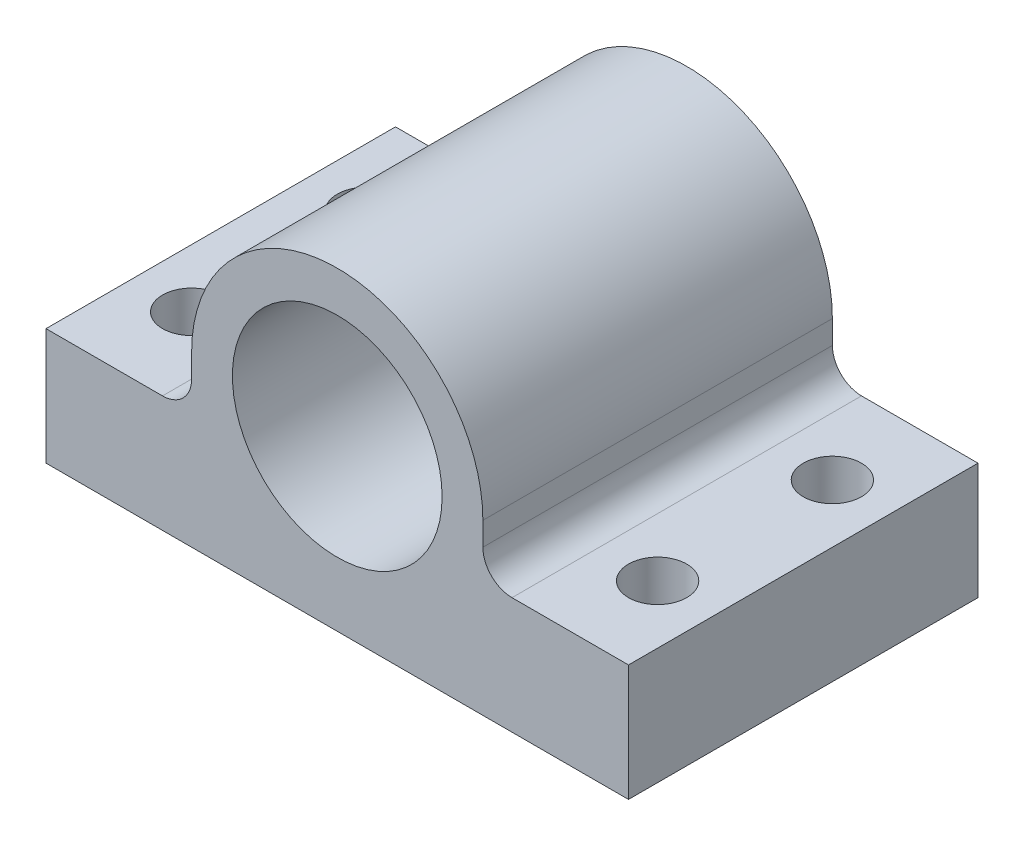
ISO-10303-21;
HEADER;
FILE_DESCRIPTION(('STEP AP214'),'2;1');
FILE_NAME('part.step','',(''),(''),'','','');
FILE_SCHEMA(('AUTOMOTIVE_DESIGN { 1 0 10303 214 1 1 1 1 }'));
ENDSEC;
DATA;
#1=APPLICATION_CONTEXT('core data for automotive mechanical design processes');
#2=APPLICATION_PROTOCOL_DEFINITION('international standard','automotive_design',2000,#1);
#3=PRODUCT_CONTEXT('',#1,'mechanical');
#4=PRODUCT('Part','Part','',(#3));
#5=PRODUCT_RELATED_PRODUCT_CATEGORY('part','',(#4));
#6=PRODUCT_DEFINITION_FORMATION('','',#4);
#7=PRODUCT_DEFINITION_CONTEXT('part definition',#1,'design');
#8=PRODUCT_DEFINITION('design','',#6,#7);
#9=PRODUCT_DEFINITION_SHAPE('','',#8);
#10=(LENGTH_UNIT() NAMED_UNIT(*) SI_UNIT(.MILLI.,.METRE.));
#11=(NAMED_UNIT(*) PLANE_ANGLE_UNIT() SI_UNIT($,.RADIAN.));
#12=(NAMED_UNIT(*) SI_UNIT($,.STERADIAN.) SOLID_ANGLE_UNIT());
#13=UNCERTAINTY_MEASURE_WITH_UNIT(LENGTH_MEASURE(1.E-05),#10,'distance_accuracy_value','');
#14=(GEOMETRIC_REPRESENTATION_CONTEXT(3) GLOBAL_UNCERTAINTY_ASSIGNED_CONTEXT((#13)) GLOBAL_UNIT_ASSIGNED_CONTEXT((#10,
#11,#12)) REPRESENTATION_CONTEXT('',''));
#15=CARTESIAN_POINT('',(0.,0.,0.));
#16=DIRECTION('',(0.,0.,1.));
#17=DIRECTION('',(1.,0.,0.));
#18=AXIS2_PLACEMENT_3D('',#15,#16,#17);
#19=CARTESIAN_POINT('',(15.,12.5,30.));
#20=DIRECTION('',(0.,0.,-1.));
#21=DIRECTION('',(-1.,0.,0.));
#22=AXIS2_PLACEMENT_3D('',#19,#20,#21);
#23=PLANE('',#22);
#24=DIRECTION('',(1.,0.,0.));
#25=VECTOR('',#24,1.);
#26=CARTESIAN_POINT('',(0.,0.,30.));
#27=LINE('',#26,#25);
#28=CARTESIAN_POINT('',(-25.,0.,30.));
#29=VERTEX_POINT('',#28);
#30=CARTESIAN_POINT('',(25.,0.,30.));
#31=VERTEX_POINT('',#30);
#32=EDGE_CURVE('E52',#29,#31,#27,.T.);
#33=ORIENTED_EDGE('',*,*,#32,.T.);
#34=DIRECTION('',(0.,1.,0.));
#35=VECTOR('',#34,1.);
#36=CARTESIAN_POINT('',(25.,10.,30.));
#37=LINE('',#36,#35);
#38=CARTESIAN_POINT('',(25.,10.,30.));
#39=VERTEX_POINT('',#38);
#40=EDGE_CURVE('E102',#31,#39,#37,.T.);
#41=ORIENTED_EDGE('',*,*,#40,.T.);
#42=DIRECTION('',(-1.,0.,0.));
#43=VECTOR('',#42,1.);
#44=CARTESIAN_POINT('',(15.,10.,30.));
#45=LINE('',#44,#43);
#46=CARTESIAN_POINT('',(15.,10.,30.));
#47=VERTEX_POINT('',#46);
#48=EDGE_CURVE('E214',#39,#47,#45,.T.);
#49=ORIENTED_EDGE('',*,*,#48,.T.);
#50=CARTESIAN_POINT('',(15.,12.5,30.));
#51=DIRECTION('',(0.,0.,-1.));
#52=DIRECTION('',(-1.,0.,0.));
#53=AXIS2_PLACEMENT_3D('',#50,#51,#52);
#54=CIRCLE('',#53,2.5);
#55=CARTESIAN_POINT('',(12.5,12.5,30.));
#56=VERTEX_POINT('',#55);
#57=EDGE_CURVE('E216',#47,#56,#54,.T.);
#58=ORIENTED_EDGE('',*,*,#57,.T.);
#59=DIRECTION('',(0.,1.,0.));
#60=VECTOR('',#59,1.);
#61=CARTESIAN_POINT('',(12.5,12.5,30.));
#62=LINE('',#61,#60);
#63=CARTESIAN_POINT('',(12.5,14.5,30.));
#64=VERTEX_POINT('',#63);
#65=EDGE_CURVE('E218',#56,#64,#62,.T.);
#66=ORIENTED_EDGE('',*,*,#65,.T.);
#67=CARTESIAN_POINT('',(0.,14.5,30.));
#68=DIRECTION('',(0.,0.,1.));
#69=DIRECTION('',(1.,0.,0.));
#70=AXIS2_PLACEMENT_3D('',#67,#68,#69);
#71=CIRCLE('',#70,12.5);
#72=CARTESIAN_POINT('',(-12.5,14.5,30.));
#73=VERTEX_POINT('',#72);
#74=EDGE_CURVE('E220',#64,#73,#71,.T.);
#75=ORIENTED_EDGE('',*,*,#74,.T.);
#76=DIRECTION('',(0.,-1.,0.));
#77=VECTOR('',#76,1.);
#78=CARTESIAN_POINT('',(-12.5,12.5,30.));
#79=LINE('',#78,#77);
#80=CARTESIAN_POINT('',(-12.5,12.5,30.));
#81=VERTEX_POINT('',#80);
#82=EDGE_CURVE('E128',#73,#81,#79,.T.);
#83=ORIENTED_EDGE('',*,*,#82,.T.);
#84=CARTESIAN_POINT('',(-15.,12.5,30.));
#85=DIRECTION('',(0.,0.,-1.));
#86=DIRECTION('',(1.,0.,0.));
#87=AXIS2_PLACEMENT_3D('',#84,#85,#86);
#88=CIRCLE('',#87,2.5);
#89=CARTESIAN_POINT('',(-15.,10.,30.));
#90=VERTEX_POINT('',#89);
#91=EDGE_CURVE('E122',#81,#90,#88,.T.);
#92=ORIENTED_EDGE('',*,*,#91,.T.);
#93=DIRECTION('',(-1.,0.,0.));
#94=VECTOR('',#93,1.);
#95=CARTESIAN_POINT('',(-15.,10.,30.));
#96=LINE('',#95,#94);
#97=CARTESIAN_POINT('',(-25.,10.,30.));
#98=VERTEX_POINT('',#97);
#99=EDGE_CURVE('E126',#90,#98,#96,.T.);
#100=ORIENTED_EDGE('',*,*,#99,.T.);
#101=DIRECTION('',(0.,-1.,0.));
#102=VECTOR('',#101,1.);
#103=CARTESIAN_POINT('',(-25.,10.,30.));
#104=LINE('',#103,#102);
#105=EDGE_CURVE('E142',#98,#29,#104,.T.);
#106=ORIENTED_EDGE('',*,*,#105,.T.);
#107=EDGE_LOOP('',(#33,#41,#49,#58,#66,#75,#83,#92,#100,#106));
#108=FACE_BOUND('',#107,.T.);
#109=CARTESIAN_POINT('',(0.,14.5,30.));
#110=DIRECTION('',(0.,0.,1.));
#111=DIRECTION('',(1.,0.,0.));
#112=AXIS2_PLACEMENT_3D('',#109,#110,#111);
#113=CIRCLE('',#112,9.);
#114=CARTESIAN_POINT('',(9.,14.5,30.));
#115=VERTEX_POINT('',#114);
#116=EDGE_CURVE('E151',#115,#115,#113,.T.);
#117=ORIENTED_EDGE('',*,*,#116,.F.);
#118=EDGE_LOOP('',(#117));
#119=FACE_BOUND('',#118,.T.);
#120=ADVANCED_FACE('F33',(#108,#119),#23,.F.);
#121=CARTESIAN_POINT('',(15.,12.5,0.));
#122=DIRECTION('',(0.,0.,-1.));
#123=DIRECTION('',(-1.,0.,0.));
#124=AXIS2_PLACEMENT_3D('',#121,#122,#123);
#125=PLANE('',#124);
#126=DIRECTION('',(0.,1.,0.));
#127=VECTOR('',#126,1.);
#128=CARTESIAN_POINT('',(25.,10.,0.));
#129=LINE('',#128,#127);
#130=CARTESIAN_POINT('',(25.,0.,0.));
#131=VERTEX_POINT('',#130);
#132=CARTESIAN_POINT('',(25.,10.,0.));
#133=VERTEX_POINT('',#132);
#134=EDGE_CURVE('E148',#131,#133,#129,.T.);
#135=ORIENTED_EDGE('',*,*,#134,.F.);
#136=DIRECTION('',(1.,0.,0.));
#137=VECTOR('',#136,1.);
#138=CARTESIAN_POINT('',(0.,0.,0.));
#139=LINE('',#138,#137);
#140=CARTESIAN_POINT('',(-25.,0.,0.));
#141=VERTEX_POINT('',#140);
#142=EDGE_CURVE('E164',#141,#131,#139,.T.);
#143=ORIENTED_EDGE('',*,*,#142,.F.);
#144=DIRECTION('',(0.,-1.,0.));
#145=VECTOR('',#144,1.);
#146=CARTESIAN_POINT('',(-25.,10.,0.));
#147=LINE('',#146,#145);
#148=CARTESIAN_POINT('',(-25.,10.,0.));
#149=VERTEX_POINT('',#148);
#150=EDGE_CURVE('E95',#149,#141,#147,.T.);
#151=ORIENTED_EDGE('',*,*,#150,.F.);
#152=DIRECTION('',(-1.,0.,0.));
#153=VECTOR('',#152,1.);
#154=CARTESIAN_POINT('',(-15.,10.,0.));
#155=LINE('',#154,#153);
#156=CARTESIAN_POINT('',(-15.,10.,0.));
#157=VERTEX_POINT('',#156);
#158=EDGE_CURVE('E88',#157,#149,#155,.T.);
#159=ORIENTED_EDGE('',*,*,#158,.F.);
#160=CARTESIAN_POINT('',(-15.,12.5,0.));
#161=DIRECTION('',(0.,0.,-1.));
#162=DIRECTION('',(1.,0.,0.));
#163=AXIS2_PLACEMENT_3D('',#160,#161,#162);
#164=CIRCLE('',#163,2.5);
#165=CARTESIAN_POINT('',(-12.5,12.5,0.));
#166=VERTEX_POINT('',#165);
#167=EDGE_CURVE('E136',#166,#157,#164,.T.);
#168=ORIENTED_EDGE('',*,*,#167,.F.);
#169=DIRECTION('',(0.,-1.,0.));
#170=VECTOR('',#169,1.);
#171=CARTESIAN_POINT('',(-12.5,12.5,0.));
#172=LINE('',#171,#170);
#173=CARTESIAN_POINT('',(-12.5,14.5,0.));
#174=VERTEX_POINT('',#173);
#175=EDGE_CURVE('E159',#174,#166,#172,.T.);
#176=ORIENTED_EDGE('',*,*,#175,.F.);
#177=CARTESIAN_POINT('',(0.,14.5,0.));
#178=DIRECTION('',(0.,0.,1.));
#179=DIRECTION('',(1.,0.,0.));
#180=AXIS2_PLACEMENT_3D('',#177,#178,#179);
#181=CIRCLE('',#180,12.5);
#182=CARTESIAN_POINT('',(12.5,14.5,0.));
#183=VERTEX_POINT('',#182);
#184=EDGE_CURVE('E157',#183,#174,#181,.T.);
#185=ORIENTED_EDGE('',*,*,#184,.F.);
#186=DIRECTION('',(0.,1.,0.));
#187=VECTOR('',#186,1.);
#188=CARTESIAN_POINT('',(12.5,12.5,0.));
#189=LINE('',#188,#187);
#190=CARTESIAN_POINT('',(12.5,12.5,0.));
#191=VERTEX_POINT('',#190);
#192=EDGE_CURVE('E155',#191,#183,#189,.T.);
#193=ORIENTED_EDGE('',*,*,#192,.F.);
#194=CARTESIAN_POINT('',(15.,12.5,0.));
#195=DIRECTION('',(0.,0.,-1.));
#196=DIRECTION('',(-1.,0.,0.));
#197=AXIS2_PLACEMENT_3D('',#194,#195,#196);
#198=CIRCLE('',#197,2.5);
#199=CARTESIAN_POINT('',(15.,10.,0.));
#200=VERTEX_POINT('',#199);
#201=EDGE_CURVE('E153',#200,#191,#198,.T.);
#202=ORIENTED_EDGE('',*,*,#201,.F.);
#203=DIRECTION('',(-1.,0.,0.));
#204=VECTOR('',#203,1.);
#205=CARTESIAN_POINT('',(15.,10.,0.));
#206=LINE('',#205,#204);
#207=EDGE_CURVE('E150',#133,#200,#206,.T.);
#208=ORIENTED_EDGE('',*,*,#207,.F.);
#209=EDGE_LOOP('',(#135,#143,#151,#159,#168,#176,#185,#193,#202,#208));
#210=FACE_BOUND('',#209,.T.);
#211=CARTESIAN_POINT('',(0.,14.5,0.));
#212=DIRECTION('',(0.,0.,1.));
#213=DIRECTION('',(1.,0.,0.));
#214=AXIS2_PLACEMENT_3D('',#211,#212,#213);
#215=CIRCLE('',#214,9.);
#216=CARTESIAN_POINT('',(9.,14.5,0.));
#217=VERTEX_POINT('',#216);
#218=EDGE_CURVE('E186',#217,#217,#215,.T.);
#219=ORIENTED_EDGE('',*,*,#218,.T.);
#220=EDGE_LOOP('',(#219));
#221=FACE_BOUND('',#220,.T.);
#222=ADVANCED_FACE('F233',(#210,#221),#125,.T.);
#223=CARTESIAN_POINT('',(25.,10.,30.));
#224=DIRECTION('',(-1.,0.,0.));
#225=DIRECTION('',(0.,0.,1.));
#226=AXIS2_PLACEMENT_3D('',#223,#224,#225);
#227=PLANE('',#226);
#228=ORIENTED_EDGE('',*,*,#134,.T.);
#229=DIRECTION('',(0.,0.,-1.));
#230=VECTOR('',#229,1.);
#231=CARTESIAN_POINT('',(25.,10.,30.));
#232=LINE('',#231,#230);
#233=EDGE_CURVE('E43',#39,#133,#232,.T.);
#234=ORIENTED_EDGE('',*,*,#233,.F.);
#235=ORIENTED_EDGE('',*,*,#40,.F.);
#236=DIRECTION('',(0.,0.,-1.));
#237=VECTOR('',#236,1.);
#238=CARTESIAN_POINT('',(25.,0.,30.));
#239=LINE('',#238,#237);
#240=EDGE_CURVE('E11',#31,#131,#239,.T.);
#241=ORIENTED_EDGE('',*,*,#240,.T.);
#242=EDGE_LOOP('',(#228,#234,#235,#241));
#243=FACE_BOUND('',#242,.T.);
#244=ADVANCED_FACE('F35',(#243),#227,.F.);
#245=CARTESIAN_POINT('',(15.,10.,30.));
#246=DIRECTION('',(0.,-1.,0.));
#247=DIRECTION('',(0.,0.,-1.));
#248=AXIS2_PLACEMENT_3D('',#245,#246,#247);
#249=PLANE('',#248);
#250=CARTESIAN_POINT('',(20.,10.,7.5));
#251=DIRECTION('',(0.,1.,0.));
#252=DIRECTION('',(0.,0.,-1.));
#253=AXIS2_PLACEMENT_3D('',#250,#251,#252);
#254=CIRCLE('',#253,2.5);
#255=CARTESIAN_POINT('',(20.,10.,5.));
#256=VERTEX_POINT('',#255);
#257=EDGE_CURVE('E203',#256,#256,#254,.T.);
#258=ORIENTED_EDGE('',*,*,#257,.F.);
#259=EDGE_LOOP('',(#258));
#260=FACE_BOUND('',#259,.T.);
#261=CARTESIAN_POINT('',(20.,10.,22.5));
#262=DIRECTION('',(0.,1.,0.));
#263=DIRECTION('',(0.,0.,1.));
#264=AXIS2_PLACEMENT_3D('',#261,#262,#263);
#265=CIRCLE('',#264,2.5);
#266=CARTESIAN_POINT('',(20.,10.,25.));
#267=VERTEX_POINT('',#266);
#268=EDGE_CURVE('E193',#267,#267,#265,.T.);
#269=ORIENTED_EDGE('',*,*,#268,.F.);
#270=EDGE_LOOP('',(#269));
#271=FACE_BOUND('',#270,.T.);
#272=ORIENTED_EDGE('',*,*,#207,.T.);
#273=DIRECTION('',(0.,0.,-1.));
#274=VECTOR('',#273,1.);
#275=CARTESIAN_POINT('',(15.,10.,30.));
#276=LINE('',#275,#274);
#277=EDGE_CURVE('E178',#47,#200,#276,.T.);
#278=ORIENTED_EDGE('',*,*,#277,.F.);
#279=ORIENTED_EDGE('',*,*,#48,.F.);
#280=ORIENTED_EDGE('',*,*,#233,.T.);
#281=EDGE_LOOP('',(#272,#278,#279,#280));
#282=FACE_BOUND('',#281,.T.);
#283=ADVANCED_FACE('F242',(#260,#271,#282),#249,.F.);
#284=CARTESIAN_POINT('',(15.,12.5,30.));
#285=DIRECTION('',(0.,0.,-1.));
#286=DIRECTION('',(-1.,0.,0.));
#287=AXIS2_PLACEMENT_3D('',#284,#285,#286);
#288=CYLINDRICAL_SURFACE('',#287,2.5);
#289=ORIENTED_EDGE('',*,*,#201,.T.);
#290=DIRECTION('',(0.,0.,-1.));
#291=VECTOR('',#290,1.);
#292=CARTESIAN_POINT('',(12.5,12.5,30.));
#293=LINE('',#292,#291);
#294=EDGE_CURVE('E175',#56,#191,#293,.T.);
#295=ORIENTED_EDGE('',*,*,#294,.F.);
#296=ORIENTED_EDGE('',*,*,#57,.F.);
#297=ORIENTED_EDGE('',*,*,#277,.T.);
#298=EDGE_LOOP('',(#289,#295,#296,#297));
#299=FACE_BOUND('',#298,.T.);
#300=ADVANCED_FACE('F247',(#299),#288,.F.);
#301=CARTESIAN_POINT('',(12.5,12.5,30.));
#302=DIRECTION('',(-1.,0.,0.));
#303=DIRECTION('',(0.,0.,1.));
#304=AXIS2_PLACEMENT_3D('',#301,#302,#303);
#305=PLANE('',#304);
#306=ORIENTED_EDGE('',*,*,#192,.T.);
#307=DIRECTION('',(0.,0.,-1.));
#308=VECTOR('',#307,1.);
#309=CARTESIAN_POINT('',(12.5,14.5,30.));
#310=LINE('',#309,#308);
#311=EDGE_CURVE('E172',#64,#183,#310,.T.);
#312=ORIENTED_EDGE('',*,*,#311,.F.);
#313=ORIENTED_EDGE('',*,*,#65,.F.);
#314=ORIENTED_EDGE('',*,*,#294,.T.);
#315=EDGE_LOOP('',(#306,#312,#313,#314));
#316=FACE_BOUND('',#315,.T.);
#317=ADVANCED_FACE('F250',(#316),#305,.F.);
#318=CARTESIAN_POINT('',(0.,14.5,30.));
#319=DIRECTION('',(0.,0.,-1.));
#320=DIRECTION('',(-1.,0.,0.));
#321=AXIS2_PLACEMENT_3D('',#318,#319,#320);
#322=CYLINDRICAL_SURFACE('',#321,12.5);
#323=ORIENTED_EDGE('',*,*,#184,.T.);
#324=DIRECTION('',(0.,0.,-1.));
#325=VECTOR('',#324,1.);
#326=CARTESIAN_POINT('',(-12.5,14.5,30.));
#327=LINE('',#326,#325);
#328=EDGE_CURVE('E169',#73,#174,#327,.T.);
#329=ORIENTED_EDGE('',*,*,#328,.F.);
#330=ORIENTED_EDGE('',*,*,#74,.F.);
#331=ORIENTED_EDGE('',*,*,#311,.T.);
#332=EDGE_LOOP('',(#323,#329,#330,#331));
#333=FACE_BOUND('',#332,.T.);
#334=ADVANCED_FACE('F226',(#333),#322,.T.);
#335=CARTESIAN_POINT('',(-12.5,12.5,30.));
#336=DIRECTION('',(1.,0.,0.));
#337=DIRECTION('',(0.,0.,-1.));
#338=AXIS2_PLACEMENT_3D('',#335,#336,#337);
#339=PLANE('',#338);
#340=ORIENTED_EDGE('',*,*,#175,.T.);
#341=DIRECTION('',(0.,0.,-1.));
#342=VECTOR('',#341,1.);
#343=CARTESIAN_POINT('',(-12.5,12.5,30.));
#344=LINE('',#343,#342);
#345=EDGE_CURVE('E137',#81,#166,#344,.T.);
#346=ORIENTED_EDGE('',*,*,#345,.F.);
#347=ORIENTED_EDGE('',*,*,#82,.F.);
#348=ORIENTED_EDGE('',*,*,#328,.T.);
#349=EDGE_LOOP('',(#340,#346,#347,#348));
#350=FACE_BOUND('',#349,.T.);
#351=ADVANCED_FACE('F230',(#350),#339,.F.);
#352=CARTESIAN_POINT('',(-15.,12.5,30.));
#353=DIRECTION('',(0.,0.,-1.));
#354=DIRECTION('',(-1.,0.,0.));
#355=AXIS2_PLACEMENT_3D('',#352,#353,#354);
#356=CYLINDRICAL_SURFACE('',#355,2.5);
#357=ORIENTED_EDGE('',*,*,#167,.T.);
#358=DIRECTION('',(0.,0.,-1.));
#359=VECTOR('',#358,1.);
#360=CARTESIAN_POINT('',(-15.,10.,30.));
#361=LINE('',#360,#359);
#362=EDGE_CURVE('E133',#90,#157,#361,.T.);
#363=ORIENTED_EDGE('',*,*,#362,.F.);
#364=ORIENTED_EDGE('',*,*,#91,.F.);
#365=ORIENTED_EDGE('',*,*,#345,.T.);
#366=EDGE_LOOP('',(#357,#363,#364,#365));
#367=FACE_BOUND('',#366,.T.);
#368=ADVANCED_FACE('F134',(#367),#356,.F.);
#369=CARTESIAN_POINT('',(-15.,10.,30.));
#370=DIRECTION('',(0.,-1.,0.));
#371=DIRECTION('',(0.,0.,-1.));
#372=AXIS2_PLACEMENT_3D('',#369,#370,#371);
#373=PLANE('',#372);
#374=CARTESIAN_POINT('',(-20.,10.,22.5));
#375=DIRECTION('',(0.,1.,0.));
#376=DIRECTION('',(0.,0.,-1.));
#377=AXIS2_PLACEMENT_3D('',#374,#375,#376);
#378=CIRCLE('',#377,2.5);
#379=CARTESIAN_POINT('',(-20.,10.,20.));
#380=VERTEX_POINT('',#379);
#381=EDGE_CURVE('E190',#380,#380,#378,.T.);
#382=ORIENTED_EDGE('',*,*,#381,.F.);
#383=EDGE_LOOP('',(#382));
#384=FACE_BOUND('',#383,.T.);
#385=CARTESIAN_POINT('',(-20.,10.,7.5));
#386=DIRECTION('',(0.,1.,0.));
#387=DIRECTION('',(0.,0.,1.));
#388=AXIS2_PLACEMENT_3D('',#385,#386,#387);
#389=CIRCLE('',#388,2.5);
#390=CARTESIAN_POINT('',(-20.,10.,10.));
#391=VERTEX_POINT('',#390);
#392=EDGE_CURVE('E187',#391,#391,#389,.T.);
#393=ORIENTED_EDGE('',*,*,#392,.F.);
#394=EDGE_LOOP('',(#393));
#395=FACE_BOUND('',#394,.T.);
#396=ORIENTED_EDGE('',*,*,#158,.T.);
#397=DIRECTION('',(0.,0.,-1.));
#398=VECTOR('',#397,1.);
#399=CARTESIAN_POINT('',(-25.,10.,30.));
#400=LINE('',#399,#398);
#401=EDGE_CURVE('E138',#98,#149,#400,.T.);
#402=ORIENTED_EDGE('',*,*,#401,.F.);
#403=ORIENTED_EDGE('',*,*,#99,.F.);
#404=ORIENTED_EDGE('',*,*,#362,.T.);
#405=EDGE_LOOP('',(#396,#402,#403,#404));
#406=FACE_BOUND('',#405,.T.);
#407=ADVANCED_FACE('F140',(#384,#395,#406),#373,.F.);
#408=CARTESIAN_POINT('',(-25.,10.,30.));
#409=DIRECTION('',(1.,0.,0.));
#410=DIRECTION('',(0.,0.,-1.));
#411=AXIS2_PLACEMENT_3D('',#408,#409,#410);
#412=PLANE('',#411);
#413=ORIENTED_EDGE('',*,*,#150,.T.);
#414=DIRECTION('',(0.,0.,-1.));
#415=VECTOR('',#414,1.);
#416=CARTESIAN_POINT('',(-25.,0.,30.));
#417=LINE('',#416,#415);
#418=EDGE_CURVE('E144',#29,#141,#417,.T.);
#419=ORIENTED_EDGE('',*,*,#418,.F.);
#420=ORIENTED_EDGE('',*,*,#105,.F.);
#421=ORIENTED_EDGE('',*,*,#401,.T.);
#422=EDGE_LOOP('',(#413,#419,#420,#421));
#423=FACE_BOUND('',#422,.T.);
#424=ADVANCED_FACE('F238',(#423),#412,.F.);
#425=CARTESIAN_POINT('',(0.,0.,30.));
#426=DIRECTION('',(0.,1.,0.));
#427=DIRECTION('',(-1.,0.,0.));
#428=AXIS2_PLACEMENT_3D('',#425,#426,#427);
#429=PLANE('',#428);
#430=CARTESIAN_POINT('',(20.,0.,7.5));
#431=DIRECTION('',(0.,1.,0.));
#432=DIRECTION('',(-1.,0.,0.));
#433=AXIS2_PLACEMENT_3D('',#430,#431,#432);
#434=CIRCLE('',#433,2.5);
#435=CARTESIAN_POINT('',(17.5,0.,7.5));
#436=VERTEX_POINT('',#435);
#437=EDGE_CURVE('E37',#436,#436,#434,.T.);
#438=ORIENTED_EDGE('',*,*,#437,.T.);
#439=EDGE_LOOP('',(#438));
#440=FACE_BOUND('',#439,.T.);
#441=CARTESIAN_POINT('',(20.,0.,22.5));
#442=DIRECTION('',(0.,1.,0.));
#443=DIRECTION('',(-1.,0.,0.));
#444=AXIS2_PLACEMENT_3D('',#441,#442,#443);
#445=CIRCLE('',#444,2.5);
#446=CARTESIAN_POINT('',(17.5,0.,22.5));
#447=VERTEX_POINT('',#446);
#448=EDGE_CURVE('E191',#447,#447,#445,.T.);
#449=ORIENTED_EDGE('',*,*,#448,.T.);
#450=EDGE_LOOP('',(#449));
#451=FACE_BOUND('',#450,.T.);
#452=CARTESIAN_POINT('',(-20.,0.,22.5));
#453=DIRECTION('',(0.,1.,0.));
#454=DIRECTION('',(-1.,0.,0.));
#455=AXIS2_PLACEMENT_3D('',#452,#453,#454);
#456=CIRCLE('',#455,2.5);
#457=CARTESIAN_POINT('',(-22.5,0.,22.5));
#458=VERTEX_POINT('',#457);
#459=EDGE_CURVE('E188',#458,#458,#456,.T.);
#460=ORIENTED_EDGE('',*,*,#459,.T.);
#461=EDGE_LOOP('',(#460));
#462=FACE_BOUND('',#461,.T.);
#463=CARTESIAN_POINT('',(-20.,0.,7.5));
#464=DIRECTION('',(0.,1.,0.));
#465=DIRECTION('',(-1.,0.,0.));
#466=AXIS2_PLACEMENT_3D('',#463,#464,#465);
#467=CIRCLE('',#466,2.5);
#468=CARTESIAN_POINT('',(-22.5,0.,7.5));
#469=VERTEX_POINT('',#468);
#470=EDGE_CURVE('E183',#469,#469,#467,.T.);
#471=ORIENTED_EDGE('',*,*,#470,.T.);
#472=EDGE_LOOP('',(#471));
#473=FACE_BOUND('',#472,.T.);
#474=ORIENTED_EDGE('',*,*,#142,.T.);
#475=ORIENTED_EDGE('',*,*,#240,.F.);
#476=ORIENTED_EDGE('',*,*,#32,.F.);
#477=ORIENTED_EDGE('',*,*,#418,.T.);
#478=EDGE_LOOP('',(#474,#475,#476,#477));
#479=FACE_BOUND('',#478,.T.);
#480=ADVANCED_FACE('F237',(#440,#451,#462,#473,#479),#429,.F.);
#481=CARTESIAN_POINT('',(0.,14.5,30.));
#482=DIRECTION('',(0.,0.,-1.));
#483=DIRECTION('',(-1.,0.,0.));
#484=AXIS2_PLACEMENT_3D('',#481,#482,#483);
#485=CYLINDRICAL_SURFACE('',#484,9.);
#486=ORIENTED_EDGE('',*,*,#116,.T.);
#487=EDGE_LOOP('',(#486));
#488=FACE_BOUND('',#487,.T.);
#489=ORIENTED_EDGE('',*,*,#218,.F.);
#490=EDGE_LOOP('',(#489));
#491=FACE_BOUND('',#490,.T.);
#492=ADVANCED_FACE('F266',(#488,#491),#485,.F.);
#493=CARTESIAN_POINT('',(-20.,-7.65,7.5));
#494=DIRECTION('',(0.,1.,0.));
#495=DIRECTION('',(0.,0.,1.));
#496=AXIS2_PLACEMENT_3D('',#493,#494,#495);
#497=CYLINDRICAL_SURFACE('',#496,2.5);
#498=ORIENTED_EDGE('',*,*,#392,.T.);
#499=EDGE_LOOP('',(#498));
#500=FACE_BOUND('',#499,.T.);
#501=ORIENTED_EDGE('',*,*,#470,.F.);
#502=EDGE_LOOP('',(#501));
#503=FACE_BOUND('',#502,.T.);
#504=ADVANCED_FACE('F308',(#500,#503),#497,.F.);
#505=CARTESIAN_POINT('',(-20.,-7.65,22.5));
#506=DIRECTION('',(0.,1.,0.));
#507=DIRECTION('',(0.,0.,1.));
#508=AXIS2_PLACEMENT_3D('',#505,#506,#507);
#509=CYLINDRICAL_SURFACE('',#508,2.5);
#510=ORIENTED_EDGE('',*,*,#381,.T.);
#511=EDGE_LOOP('',(#510));
#512=FACE_BOUND('',#511,.T.);
#513=ORIENTED_EDGE('',*,*,#459,.F.);
#514=EDGE_LOOP('',(#513));
#515=FACE_BOUND('',#514,.T.);
#516=ADVANCED_FACE('F314',(#512,#515),#509,.F.);
#517=CARTESIAN_POINT('',(20.,-7.65,22.5));
#518=DIRECTION('',(0.,1.,0.));
#519=DIRECTION('',(0.,0.,1.));
#520=AXIS2_PLACEMENT_3D('',#517,#518,#519);
#521=CYLINDRICAL_SURFACE('',#520,2.5);
#522=ORIENTED_EDGE('',*,*,#268,.T.);
#523=EDGE_LOOP('',(#522));
#524=FACE_BOUND('',#523,.T.);
#525=ORIENTED_EDGE('',*,*,#448,.F.);
#526=EDGE_LOOP('',(#525));
#527=FACE_BOUND('',#526,.T.);
#528=ADVANCED_FACE('F321',(#524,#527),#521,.F.);
#529=CARTESIAN_POINT('',(20.,-7.65,7.5));
#530=DIRECTION('',(0.,1.,0.));
#531=DIRECTION('',(0.,0.,1.));
#532=AXIS2_PLACEMENT_3D('',#529,#530,#531);
#533=CYLINDRICAL_SURFACE('',#532,2.5);
#534=ORIENTED_EDGE('',*,*,#257,.T.);
#535=EDGE_LOOP('',(#534));
#536=FACE_BOUND('',#535,.T.);
#537=ORIENTED_EDGE('',*,*,#437,.F.);
#538=EDGE_LOOP('',(#537));
#539=FACE_BOUND('',#538,.T.);
#540=ADVANCED_FACE('F329',(#536,#539),#533,.F.);
#541=CLOSED_SHELL('',(#120,#222,#244,#283,#300,#317,#334,#351,#368,#407,#424,#480,#492,#504,
#516,#528,#540));
#542=MANIFOLD_SOLID_BREP('B2',#541);
#543=ADVANCED_BREP_SHAPE_REPRESENTATION('',(#18,#542),#14);
#544=SHAPE_DEFINITION_REPRESENTATION(#9,#543);
ENDSEC;
END-ISO-10303-21;
